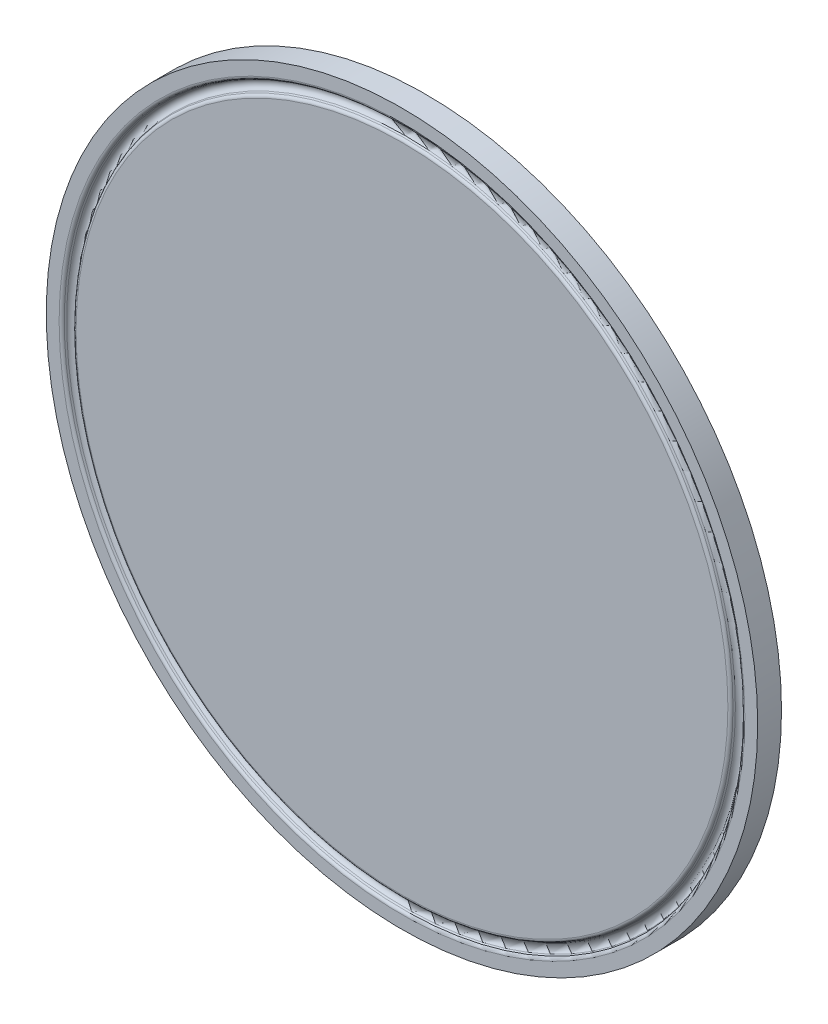
ISO-10303-21;
HEADER;
FILE_DESCRIPTION(('STEP AP214'),'2;1');
FILE_NAME('part.step','',(''),(''),'','','');
FILE_SCHEMA(('AUTOMOTIVE_DESIGN { 1 0 10303 214 1 1 1 1 }'));
ENDSEC;
DATA;
#1=APPLICATION_CONTEXT('core data for automotive mechanical design processes');
#2=APPLICATION_PROTOCOL_DEFINITION('international standard','automotive_design',2000,#1);
#3=PRODUCT_CONTEXT('',#1,'mechanical');
#4=PRODUCT('Part','Part','',(#3));
#5=PRODUCT_RELATED_PRODUCT_CATEGORY('part','',(#4));
#6=PRODUCT_DEFINITION_FORMATION('','',#4);
#7=PRODUCT_DEFINITION_CONTEXT('part definition',#1,'design');
#8=PRODUCT_DEFINITION('design','',#6,#7);
#9=PRODUCT_DEFINITION_SHAPE('','',#8);
#10=(LENGTH_UNIT() NAMED_UNIT(*) SI_UNIT(.MILLI.,.METRE.));
#11=(NAMED_UNIT(*) PLANE_ANGLE_UNIT() SI_UNIT($,.RADIAN.));
#12=(NAMED_UNIT(*) SI_UNIT($,.STERADIAN.) SOLID_ANGLE_UNIT());
#13=UNCERTAINTY_MEASURE_WITH_UNIT(LENGTH_MEASURE(1.E-05),#10,'distance_accuracy_value','');
#14=(GEOMETRIC_REPRESENTATION_CONTEXT(3) GLOBAL_UNCERTAINTY_ASSIGNED_CONTEXT((#13)) GLOBAL_UNIT_ASSIGNED_CONTEXT((#10,
#11,#12)) REPRESENTATION_CONTEXT('',''));
#15=CARTESIAN_POINT('',(0.,0.,0.));
#16=DIRECTION('',(0.,0.,1.));
#17=DIRECTION('',(1.,0.,0.));
#18=AXIS2_PLACEMENT_3D('',#15,#16,#17);
#19=CARTESIAN_POINT('',(0.,68.2954539594501,-11.0998));
#20=DIRECTION('',(0.,0.,1.));
#21=DIRECTION('',(1.,0.,0.));
#22=AXIS2_PLACEMENT_3D('',#19,#20,#21);
#23=PLANE('',#22);
#24=CARTESIAN_POINT('',(0.,0.,-11.0998));
#25=DIRECTION('',(0.,0.,1.));
#26=DIRECTION('',(1.,0.,0.));
#27=AXIS2_PLACEMENT_3D('',#24,#25,#26);
#28=CIRCLE('',#27,68.2954539594501);
#29=CARTESIAN_POINT('',(68.2954539594501,0.,-11.0998));
#30=VERTEX_POINT('',#29);
#31=EDGE_CURVE('E10',#30,#30,#28,.T.);
#32=ORIENTED_EDGE('',*,*,#31,.F.);
#33=EDGE_LOOP('',(#32));
#34=FACE_BOUND('',#33,.T.);
#35=ADVANCED_FACE('F36',(#34),#23,.F.);
#36=CARTESIAN_POINT('',(0.,0.,-11.0998));
#37=DIRECTION('',(0.,0.,1.));
#38=DIRECTION('',(1.,0.,0.));
#39=AXIS2_PLACEMENT_3D('',#36,#37,#38);
#40=CONICAL_SURFACE('',#39,68.2954539594501,1.22173047639603);
#41=CARTESIAN_POINT('',(0.,0.,-5.588));
#42=DIRECTION('',(0.,0.,1.));
#43=DIRECTION('',(1.,0.,0.));
#44=AXIS2_PLACEMENT_3D('',#41,#42,#43);
#45=CIRCLE('',#44,83.439);
#46=CARTESIAN_POINT('',(83.439,0.,-5.588));
#47=VERTEX_POINT('',#46);
#48=EDGE_CURVE('E43',#47,#47,#45,.T.);
#49=ORIENTED_EDGE('',*,*,#48,.F.);
#50=EDGE_LOOP('',(#49));
#51=FACE_BOUND('',#50,.T.);
#52=ORIENTED_EDGE('',*,*,#31,.T.);
#53=EDGE_LOOP('',(#52));
#54=FACE_BOUND('',#53,.T.);
#55=ADVANCED_FACE('F120',(#51,#54),#40,.T.);
#56=CARTESIAN_POINT('',(0.,0.,0.));
#57=DIRECTION('',(0.,0.,1.));
#58=DIRECTION('',(1.,0.,0.));
#59=AXIS2_PLACEMENT_3D('',#56,#57,#58);
#60=CYLINDRICAL_SURFACE('',#59,83.439);
#61=CARTESIAN_POINT('',(0.,0.,0.));
#62=DIRECTION('',(0.,0.,1.));
#63=DIRECTION('',(1.,0.,0.));
#64=AXIS2_PLACEMENT_3D('',#61,#62,#63);
#65=CIRCLE('',#64,83.439);
#66=CARTESIAN_POINT('',(83.439,0.,0.));
#67=VERTEX_POINT('',#66);
#68=EDGE_CURVE('E49',#67,#67,#65,.T.);
#69=ORIENTED_EDGE('',*,*,#68,.F.);
#70=EDGE_LOOP('',(#69));
#71=FACE_BOUND('',#70,.T.);
#72=ORIENTED_EDGE('',*,*,#48,.T.);
#73=EDGE_LOOP('',(#72));
#74=FACE_BOUND('',#73,.T.);
#75=ADVANCED_FACE('F115',(#71,#74),#60,.T.);
#76=CARTESIAN_POINT('',(0.,80.4257722747395,0.));
#77=DIRECTION('',(0.,0.,-1.));
#78=DIRECTION('',(-1.,0.,0.));
#79=AXIS2_PLACEMENT_3D('',#76,#77,#78);
#80=PLANE('',#79);
#81=CARTESIAN_POINT('',(0.,0.,0.));
#82=DIRECTION('',(0.,0.,1.));
#83=DIRECTION('',(1.,0.,0.));
#84=AXIS2_PLACEMENT_3D('',#81,#82,#83);
#85=CIRCLE('',#84,80.4257722747395);
#86=CARTESIAN_POINT('',(80.4257722747395,0.,0.));
#87=VERTEX_POINT('',#86);
#88=EDGE_CURVE('E54',#87,#87,#85,.T.);
#89=ORIENTED_EDGE('',*,*,#88,.F.);
#90=EDGE_LOOP('',(#89));
#91=FACE_BOUND('',#90,.T.);
#92=ORIENTED_EDGE('',*,*,#68,.T.);
#93=EDGE_LOOP('',(#92));
#94=FACE_BOUND('',#93,.T.);
#95=ADVANCED_FACE('F109',(#91,#94),#80,.F.);
#96=CARTESIAN_POINT('',(0.,0.,-0.7874));
#97=DIRECTION('',(0.,0.,1.));
#98=DIRECTION('',(1.,0.,0.));
#99=AXIS2_PLACEMENT_3D('',#96,#97,#98);
#100=TOROIDAL_SURFACE('',#99,80.4257722747395,0.787400000000004);
#101=CARTESIAN_POINT('',(0.,0.,-0.479738309427544));
#102=DIRECTION('',(0.,0.,1.));
#103=DIRECTION('',(1.,0.,0.));
#104=AXIS2_PLACEMENT_3D('',#101,#102,#103);
#105=CIRCLE('',#104,79.700966753131);
#106=CARTESIAN_POINT('',(79.700966753131,0.,-0.479738309427544));
#107=VERTEX_POINT('',#106);
#108=EDGE_CURVE('E60',#107,#107,#105,.T.);
#109=ORIENTED_EDGE('',*,*,#108,.F.);
#110=EDGE_LOOP('',(#109));
#111=FACE_BOUND('',#110,.T.);
#112=ORIENTED_EDGE('',*,*,#88,.T.);
#113=EDGE_LOOP('',(#112));
#114=FACE_BOUND('',#113,.T.);
#115=ADVANCED_FACE('F103',(#111,#114),#100,.T.);
#116=CARTESIAN_POINT('',(0.,0.,-0.479738309427544));
#117=DIRECTION('',(0.,0.,1.));
#118=DIRECTION('',(1.,0.,0.));
#119=AXIS2_PLACEMENT_3D('',#116,#117,#118);
#120=CONICAL_SURFACE('',#119,79.700966753131,0.40142572795866);
#121=CARTESIAN_POINT('',(0.,0.,-0.872854821190487));
#122=DIRECTION('',(0.,0.,1.));
#123=DIRECTION('',(1.,0.,0.));
#124=AXIS2_PLACEMENT_3D('',#121,#122,#123);
#125=CIRCLE('',#124,79.5340986940515);
#126=CARTESIAN_POINT('',(79.5340986940515,0.,-0.872854821190487));
#127=VERTEX_POINT('',#126);
#128=EDGE_CURVE('E64',#127,#127,#125,.T.);
#129=ORIENTED_EDGE('',*,*,#128,.F.);
#130=EDGE_LOOP('',(#129));
#131=FACE_BOUND('',#130,.T.);
#132=ORIENTED_EDGE('',*,*,#108,.T.);
#133=EDGE_LOOP('',(#132));
#134=FACE_BOUND('',#133,.T.);
#135=ADVANCED_FACE('F97',(#131,#134),#120,.F.);
#136=CARTESIAN_POINT('',(0.,0.,-0.4064));
#137=DIRECTION('',(0.,0.,1.));
#138=DIRECTION('',(1.,0.,0.));
#139=AXIS2_PLACEMENT_3D('',#136,#137,#138);
#140=TOROIDAL_SURFACE('',#139,78.4352,1.1938);
#141=CARTESIAN_POINT('',(0.,0.,-0.872854821190497));
#142=DIRECTION('',(0.,0.,1.));
#143=DIRECTION('',(1.,0.,0.));
#144=AXIS2_PLACEMENT_3D('',#141,#142,#143);
#145=CIRCLE('',#144,77.3363013059485);
#146=CARTESIAN_POINT('',(77.3363013059485,0.,-0.872854821190497));
#147=VERTEX_POINT('',#146);
#148=EDGE_CURVE('E67',#147,#147,#145,.T.);
#149=ORIENTED_EDGE('',*,*,#148,.F.);
#150=EDGE_LOOP('',(#149));
#151=FACE_BOUND('',#150,.T.);
#152=ORIENTED_EDGE('',*,*,#128,.T.);
#153=EDGE_LOOP('',(#152));
#154=FACE_BOUND('',#153,.T.);
#155=ADVANCED_FACE('F91',(#151,#154),#140,.F.);
#156=CARTESIAN_POINT('',(0.,0.,-0.872854821190497));
#157=DIRECTION('',(0.,0.,-1.));
#158=DIRECTION('',(-1.,0.,0.));
#159=AXIS2_PLACEMENT_3D('',#156,#157,#158);
#160=CONICAL_SURFACE('',#159,77.3363013059485,0.401425727958679);
#161=CARTESIAN_POINT('',(0.,0.,-0.479738309427542));
#162=DIRECTION('',(0.,0.,1.));
#163=DIRECTION('',(1.,0.,0.));
#164=AXIS2_PLACEMENT_3D('',#161,#162,#163);
#165=CIRCLE('',#164,77.1694332468689);
#166=CARTESIAN_POINT('',(77.1694332468689,0.,-0.479738309427542));
#167=VERTEX_POINT('',#166);
#168=EDGE_CURVE('E71',#167,#167,#165,.T.);
#169=ORIENTED_EDGE('',*,*,#168,.F.);
#170=EDGE_LOOP('',(#169));
#171=FACE_BOUND('',#170,.T.);
#172=ORIENTED_EDGE('',*,*,#148,.T.);
#173=EDGE_LOOP('',(#172));
#174=FACE_BOUND('',#173,.T.);
#175=ADVANCED_FACE('F85',(#171,#174),#160,.T.);
#176=CARTESIAN_POINT('',(0.,0.,-0.7874));
#177=DIRECTION('',(0.,0.,1.));
#178=DIRECTION('',(1.,0.,0.));
#179=AXIS2_PLACEMENT_3D('',#176,#177,#178);
#180=TOROIDAL_SURFACE('',#179,76.4446277252605,0.787399999999998);
#181=CARTESIAN_POINT('',(0.,0.,0.));
#182=DIRECTION('',(0.,0.,1.));
#183=DIRECTION('',(1.,0.,0.));
#184=AXIS2_PLACEMENT_3D('',#181,#182,#183);
#185=CIRCLE('',#184,76.4446277252605);
#186=CARTESIAN_POINT('',(76.4446277252605,0.,0.));
#187=VERTEX_POINT('',#186);
#188=EDGE_CURVE('E75',#187,#187,#185,.T.);
#189=ORIENTED_EDGE('',*,*,#188,.F.);
#190=EDGE_LOOP('',(#189));
#191=FACE_BOUND('',#190,.T.);
#192=ORIENTED_EDGE('',*,*,#168,.T.);
#193=EDGE_LOOP('',(#192));
#194=FACE_BOUND('',#193,.T.);
#195=ADVANCED_FACE('F82',(#191,#194),#180,.T.);
#196=CARTESIAN_POINT('',(0.,0.,0.));
#197=DIRECTION('',(0.,0.,-1.));
#198=DIRECTION('',(-1.,0.,0.));
#199=AXIS2_PLACEMENT_3D('',#196,#197,#198);
#200=PLANE('',#199);
#201=ORIENTED_EDGE('',*,*,#188,.T.);
#202=EDGE_LOOP('',(#201));
#203=FACE_BOUND('',#202,.T.);
#204=ADVANCED_FACE('F80',(#203),#200,.F.);
#205=CLOSED_SHELL('',(#35,#55,#75,#95,#115,#135,#155,#175,#195,#204));
#206=MANIFOLD_SOLID_BREP('B2',#205);
#207=ADVANCED_BREP_SHAPE_REPRESENTATION('',(#18,#206),#14);
#208=SHAPE_DEFINITION_REPRESENTATION(#9,#207);
ENDSEC;
END-ISO-10303-21;
